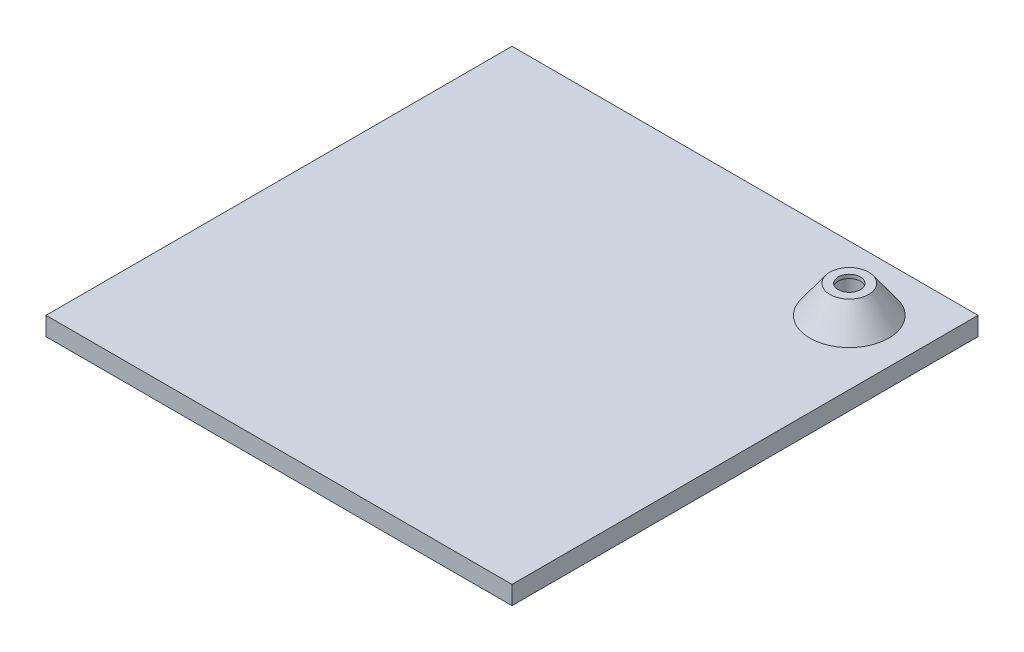
ISO-10303-21;
HEADER;
FILE_DESCRIPTION(('STEP AP214'),'2;1');
FILE_NAME('part.step','',(''),(''),'','','');
FILE_SCHEMA(('AUTOMOTIVE_DESIGN { 1 0 10303 214 1 1 1 1 }'));
ENDSEC;
DATA;
#1=APPLICATION_CONTEXT('core data for automotive mechanical design processes');
#2=APPLICATION_PROTOCOL_DEFINITION('international standard','automotive_design',2000,#1);
#3=PRODUCT_CONTEXT('',#1,'mechanical');
#4=PRODUCT('Part','Part','',(#3));
#5=PRODUCT_RELATED_PRODUCT_CATEGORY('part','',(#4));
#6=PRODUCT_DEFINITION_FORMATION('','',#4);
#7=PRODUCT_DEFINITION_CONTEXT('part definition',#1,'design');
#8=PRODUCT_DEFINITION('design','',#6,#7);
#9=PRODUCT_DEFINITION_SHAPE('','',#8);
#10=(LENGTH_UNIT() NAMED_UNIT(*) SI_UNIT(.MILLI.,.METRE.));
#11=(NAMED_UNIT(*) PLANE_ANGLE_UNIT() SI_UNIT($,.RADIAN.));
#12=(NAMED_UNIT(*) SI_UNIT($,.STERADIAN.) SOLID_ANGLE_UNIT());
#13=UNCERTAINTY_MEASURE_WITH_UNIT(LENGTH_MEASURE(1.E-05),#10,'distance_accuracy_value','');
#14=(GEOMETRIC_REPRESENTATION_CONTEXT(3) GLOBAL_UNCERTAINTY_ASSIGNED_CONTEXT((#13)) GLOBAL_UNIT_ASSIGNED_CONTEXT((#10,
#11,#12)) REPRESENTATION_CONTEXT('',''));
#15=CARTESIAN_POINT('',(0.,0.,0.));
#16=DIRECTION('',(0.,0.,1.));
#17=DIRECTION('',(1.,0.,0.));
#18=AXIS2_PLACEMENT_3D('',#15,#16,#17);
#19=CARTESIAN_POINT('',(0.,5.,0.));
#20=DIRECTION('',(1.,0.,0.));
#21=DIRECTION('',(0.,0.,-1.));
#22=AXIS2_PLACEMENT_3D('',#19,#20,#21);
#23=PLANE('',#22);
#24=DIRECTION('',(0.,0.,1.));
#25=VECTOR('',#24,1.);
#26=CARTESIAN_POINT('',(0.,0.,0.));
#27=LINE('',#26,#25);
#28=CARTESIAN_POINT('',(0.,0.,-126.));
#29=VERTEX_POINT('',#28);
#30=CARTESIAN_POINT('',(0.,0.,0.));
#31=VERTEX_POINT('',#30);
#32=EDGE_CURVE('E115',#29,#31,#27,.T.);
#33=ORIENTED_EDGE('',*,*,#32,.T.);
#34=DIRECTION('',(0.,-1.,0.));
#35=VECTOR('',#34,1.);
#36=CARTESIAN_POINT('',(0.,5.,0.));
#37=LINE('',#36,#35);
#38=CARTESIAN_POINT('',(0.,5.,0.));
#39=VERTEX_POINT('',#38);
#40=EDGE_CURVE('E104',#39,#31,#37,.T.);
#41=ORIENTED_EDGE('',*,*,#40,.F.);
#42=DIRECTION('',(0.,0.,1.));
#43=VECTOR('',#42,1.);
#44=CARTESIAN_POINT('',(0.,5.,0.));
#45=LINE('',#44,#43);
#46=CARTESIAN_POINT('',(0.,5.,-126.));
#47=VERTEX_POINT('',#46);
#48=EDGE_CURVE('E96',#47,#39,#45,.T.);
#49=ORIENTED_EDGE('',*,*,#48,.F.);
#50=DIRECTION('',(0.,-1.,0.));
#51=VECTOR('',#50,1.);
#52=CARTESIAN_POINT('',(0.,5.,-126.));
#53=LINE('',#52,#51);
#54=EDGE_CURVE('E111',#47,#29,#53,.T.);
#55=ORIENTED_EDGE('',*,*,#54,.T.);
#56=EDGE_LOOP('',(#33,#41,#49,#55));
#57=FACE_BOUND('',#56,.T.);
#58=ADVANCED_FACE('F41',(#57),#23,.F.);
#59=CARTESIAN_POINT('',(0.,5.,0.));
#60=DIRECTION('',(0.,0.,-1.));
#61=DIRECTION('',(-1.,0.,0.));
#62=AXIS2_PLACEMENT_3D('',#59,#60,#61);
#63=PLANE('',#62);
#64=DIRECTION('',(1.,0.,0.));
#65=VECTOR('',#64,1.);
#66=CARTESIAN_POINT('',(0.,0.,0.));
#67=LINE('',#66,#65);
#68=CARTESIAN_POINT('',(126.,0.,0.));
#69=VERTEX_POINT('',#68);
#70=EDGE_CURVE('E102',#31,#69,#67,.T.);
#71=ORIENTED_EDGE('',*,*,#70,.T.);
#72=DIRECTION('',(0.,-1.,0.));
#73=VECTOR('',#72,1.);
#74=CARTESIAN_POINT('',(126.,5.,0.));
#75=LINE('',#74,#73);
#76=CARTESIAN_POINT('',(126.,5.,0.));
#77=VERTEX_POINT('',#76);
#78=EDGE_CURVE('E100',#77,#69,#75,.T.);
#79=ORIENTED_EDGE('',*,*,#78,.F.);
#80=DIRECTION('',(1.,0.,0.));
#81=VECTOR('',#80,1.);
#82=CARTESIAN_POINT('',(0.,5.,0.));
#83=LINE('',#82,#81);
#84=EDGE_CURVE('E91',#39,#77,#83,.T.);
#85=ORIENTED_EDGE('',*,*,#84,.F.);
#86=ORIENTED_EDGE('',*,*,#40,.T.);
#87=EDGE_LOOP('',(#71,#79,#85,#86));
#88=FACE_BOUND('',#87,.T.);
#89=ADVANCED_FACE('F101',(#88),#63,.F.);
#90=CARTESIAN_POINT('',(126.,5.,0.));
#91=DIRECTION('',(-1.,0.,0.));
#92=DIRECTION('',(0.,0.,1.));
#93=AXIS2_PLACEMENT_3D('',#90,#91,#92);
#94=PLANE('',#93);
#95=DIRECTION('',(0.,0.,-1.));
#96=VECTOR('',#95,1.);
#97=CARTESIAN_POINT('',(126.,0.,0.));
#98=LINE('',#97,#96);
#99=CARTESIAN_POINT('',(126.,0.,-126.));
#100=VERTEX_POINT('',#99);
#101=EDGE_CURVE('E77',#69,#100,#98,.T.);
#102=ORIENTED_EDGE('',*,*,#101,.T.);
#103=DIRECTION('',(0.,-1.,0.));
#104=VECTOR('',#103,1.);
#105=CARTESIAN_POINT('',(126.,5.,-126.));
#106=LINE('',#105,#104);
#107=CARTESIAN_POINT('',(126.,5.,-126.));
#108=VERTEX_POINT('',#107);
#109=EDGE_CURVE('E105',#108,#100,#106,.T.);
#110=ORIENTED_EDGE('',*,*,#109,.F.);
#111=DIRECTION('',(0.,0.,-1.));
#112=VECTOR('',#111,1.);
#113=CARTESIAN_POINT('',(126.,5.,0.));
#114=LINE('',#113,#112);
#115=EDGE_CURVE('E94',#77,#108,#114,.T.);
#116=ORIENTED_EDGE('',*,*,#115,.F.);
#117=ORIENTED_EDGE('',*,*,#78,.T.);
#118=EDGE_LOOP('',(#102,#110,#116,#117));
#119=FACE_BOUND('',#118,.T.);
#120=ADVANCED_FACE('F107',(#119),#94,.F.);
#121=CARTESIAN_POINT('',(0.,5.,-126.));
#122=DIRECTION('',(0.,0.,1.));
#123=DIRECTION('',(1.,0.,0.));
#124=AXIS2_PLACEMENT_3D('',#121,#122,#123);
#125=PLANE('',#124);
#126=DIRECTION('',(-1.,0.,0.));
#127=VECTOR('',#126,1.);
#128=CARTESIAN_POINT('',(0.,0.,-126.));
#129=LINE('',#128,#127);
#130=EDGE_CURVE('E83',#100,#29,#129,.T.);
#131=ORIENTED_EDGE('',*,*,#130,.T.);
#132=ORIENTED_EDGE('',*,*,#54,.F.);
#133=DIRECTION('',(-1.,0.,0.));
#134=VECTOR('',#133,1.);
#135=CARTESIAN_POINT('',(0.,5.,-126.));
#136=LINE('',#135,#134);
#137=EDGE_CURVE('E60',#108,#47,#136,.T.);
#138=ORIENTED_EDGE('',*,*,#137,.F.);
#139=ORIENTED_EDGE('',*,*,#109,.T.);
#140=EDGE_LOOP('',(#131,#132,#138,#139));
#141=FACE_BOUND('',#140,.T.);
#142=ADVANCED_FACE('F163',(#141),#125,.F.);
#143=CARTESIAN_POINT('',(0.,5.,0.));
#144=DIRECTION('',(0.,-1.,0.));
#145=DIRECTION('',(0.,0.,-1.));
#146=AXIS2_PLACEMENT_3D('',#143,#144,#145);
#147=PLANE('',#146);
#148=CARTESIAN_POINT('',(108.6,5.,-108.6));
#149=DIRECTION('',(0.,-1.,0.));
#150=DIRECTION('',(0.,0.,-1.));
#151=AXIS2_PLACEMENT_3D('',#148,#149,#150);
#152=CIRCLE('',#151,10.6836436799865);
#153=CARTESIAN_POINT('',(108.6,5.,-119.283643679987));
#154=VERTEX_POINT('',#153);
#155=EDGE_CURVE('E11',#154,#154,#152,.T.);
#156=ORIENTED_EDGE('',*,*,#155,.T.);
#157=EDGE_LOOP('',(#156));
#158=FACE_BOUND('',#157,.T.);
#159=ORIENTED_EDGE('',*,*,#48,.T.);
#160=ORIENTED_EDGE('',*,*,#84,.T.);
#161=ORIENTED_EDGE('',*,*,#115,.T.);
#162=ORIENTED_EDGE('',*,*,#137,.T.);
#163=EDGE_LOOP('',(#159,#160,#161,#162));
#164=FACE_BOUND('',#163,.T.);
#165=ADVANCED_FACE('F92',(#158,#164),#147,.F.);
#166=CARTESIAN_POINT('',(0.,0.,0.));
#167=DIRECTION('',(0.,-1.,0.));
#168=DIRECTION('',(0.,0.,-1.));
#169=AXIS2_PLACEMENT_3D('',#166,#167,#168);
#170=PLANE('',#169);
#171=CARTESIAN_POINT('',(108.6,0.,-108.6));
#172=DIRECTION('',(0.,-1.,0.));
#173=DIRECTION('',(0.,0.,-1.));
#174=AXIS2_PLACEMENT_3D('',#171,#172,#173);
#175=CIRCLE('',#174,3.44999999999999);
#176=CARTESIAN_POINT('',(108.6,0.,-112.05));
#177=VERTEX_POINT('',#176);
#178=EDGE_CURVE('E135',#177,#177,#175,.T.);
#179=ORIENTED_EDGE('',*,*,#178,.F.);
#180=EDGE_LOOP('',(#179));
#181=FACE_BOUND('',#180,.T.);
#182=ORIENTED_EDGE('',*,*,#32,.F.);
#183=ORIENTED_EDGE('',*,*,#130,.F.);
#184=ORIENTED_EDGE('',*,*,#101,.F.);
#185=ORIENTED_EDGE('',*,*,#70,.F.);
#186=EDGE_LOOP('',(#182,#183,#184,#185));
#187=FACE_BOUND('',#186,.T.);
#188=ADVANCED_FACE('F166',(#181,#187),#170,.T.);
#189=CARTESIAN_POINT('',(108.6,12.5,-108.6));
#190=DIRECTION('',(0.,1.,0.));
#191=DIRECTION('',(0.,0.,1.));
#192=AXIS2_PLACEMENT_3D('',#189,#190,#191);
#193=PLANE('',#192);
#194=CARTESIAN_POINT('',(108.6,12.5,-108.6));
#195=DIRECTION('',(0.,1.,0.));
#196=DIRECTION('',(0.,0.,1.));
#197=AXIS2_PLACEMENT_3D('',#194,#195,#196);
#198=CIRCLE('',#197,5.23457471994626);
#199=CARTESIAN_POINT('',(108.6,12.5,-113.834574719946));
#200=VERTEX_POINT('',#199);
#201=EDGE_CURVE('E52',#200,#200,#198,.T.);
#202=ORIENTED_EDGE('',*,*,#201,.T.);
#203=EDGE_LOOP('',(#202));
#204=FACE_BOUND('',#203,.T.);
#205=CARTESIAN_POINT('',(108.6,12.5,-108.6));
#206=DIRECTION('',(0.,1.,0.));
#207=DIRECTION('',(0.,0.,1.));
#208=AXIS2_PLACEMENT_3D('',#205,#206,#207);
#209=CIRCLE('',#208,3.00000000000001);
#210=CARTESIAN_POINT('',(108.6,12.5,-105.6));
#211=VERTEX_POINT('',#210);
#212=EDGE_CURVE('E136',#211,#211,#209,.T.);
#213=ORIENTED_EDGE('',*,*,#212,.F.);
#214=EDGE_LOOP('',(#213));
#215=FACE_BOUND('',#214,.T.);
#216=ADVANCED_FACE('F141',(#204,#215),#193,.T.);
#217=CARTESIAN_POINT('',(108.6,11.5,-108.6));
#218=DIRECTION('',(0.,-1.,0.));
#219=DIRECTION('',(0.,0.,-1.));
#220=AXIS2_PLACEMENT_3D('',#217,#218,#219);
#221=CYLINDRICAL_SURFACE('',#220,3.44999999999999);
#222=CARTESIAN_POINT('',(108.6,11.5,-108.6));
#223=DIRECTION('',(0.,-1.,0.));
#224=DIRECTION('',(0.,0.,-1.));
#225=AXIS2_PLACEMENT_3D('',#222,#223,#224);
#226=CIRCLE('',#225,3.44999999999999);
#227=CARTESIAN_POINT('',(108.6,11.5,-112.05));
#228=VERTEX_POINT('',#227);
#229=EDGE_CURVE('E119',#228,#228,#226,.T.);
#230=ORIENTED_EDGE('',*,*,#229,.F.);
#231=EDGE_LOOP('',(#230));
#232=FACE_BOUND('',#231,.T.);
#233=ORIENTED_EDGE('',*,*,#178,.T.);
#234=EDGE_LOOP('',(#233));
#235=FACE_BOUND('',#234,.T.);
#236=ADVANCED_FACE('F175',(#232,#235),#221,.F.);
#237=CARTESIAN_POINT('',(108.6,11.5,-108.6));
#238=DIRECTION('',(0.,-1.,0.));
#239=DIRECTION('',(0.,0.,-1.));
#240=AXIS2_PLACEMENT_3D('',#237,#238,#239);
#241=PLANE('',#240);
#242=CARTESIAN_POINT('',(108.6,11.5,-108.6));
#243=DIRECTION('',(0.,-1.,0.));
#244=DIRECTION('',(0.,0.,-1.));
#245=AXIS2_PLACEMENT_3D('',#242,#243,#244);
#246=CIRCLE('',#245,3.00000000000001);
#247=CARTESIAN_POINT('',(108.6,11.5,-111.6));
#248=VERTEX_POINT('',#247);
#249=EDGE_CURVE('E132',#248,#248,#246,.T.);
#250=ORIENTED_EDGE('',*,*,#249,.F.);
#251=EDGE_LOOP('',(#250));
#252=FACE_BOUND('',#251,.T.);
#253=ORIENTED_EDGE('',*,*,#229,.T.);
#254=EDGE_LOOP('',(#253));
#255=FACE_BOUND('',#254,.T.);
#256=ADVANCED_FACE('F150',(#252,#255),#241,.T.);
#257=CARTESIAN_POINT('',(108.6,0.,-108.6));
#258=DIRECTION('',(0.,1.,0.));
#259=DIRECTION('',(0.,0.,1.));
#260=AXIS2_PLACEMENT_3D('',#257,#258,#259);
#261=CYLINDRICAL_SURFACE('',#260,3.00000000000001);
#262=ORIENTED_EDGE('',*,*,#249,.T.);
#263=EDGE_LOOP('',(#262));
#264=FACE_BOUND('',#263,.T.);
#265=ORIENTED_EDGE('',*,*,#212,.T.);
#266=EDGE_LOOP('',(#265));
#267=FACE_BOUND('',#266,.T.);
#268=ADVANCED_FACE('F145',(#264,#267),#261,.F.);
#269=CARTESIAN_POINT('',(108.6,12.5,-108.6));
#270=DIRECTION('',(0.,-1.,0.));
#271=DIRECTION('',(0.,0.,-1.));
#272=AXIS2_PLACEMENT_3D('',#269,#270,#271);
#273=CONICAL_SURFACE('',#272,5.23457471994626,0.628318530717965);
#274=CARTESIAN_POINT('',(108.6,5.,-119.283643679987));
#275=CARTESIAN_POINT('',(108.6,5.078125,-119.226882544986));
#276=CARTESIAN_POINT('',(108.6,5.15625,-119.170121409986));
#277=CARTESIAN_POINT('',(108.6,5.3125,-119.056599139985));
#278=CARTESIAN_POINT('',(108.6,5.390625,-118.999838004984));
#279=CARTESIAN_POINT('',(108.6,5.546875,-118.886315734984));
#280=CARTESIAN_POINT('',(108.6,5.625,-118.829554599983));
#281=CARTESIAN_POINT('',(108.6,5.78125,-118.716032329982));
#282=CARTESIAN_POINT('',(108.6,5.859375,-118.659271194982));
#283=CARTESIAN_POINT('',(108.6,6.015625,-118.545748924981));
#284=CARTESIAN_POINT('',(108.6,6.09375,-118.488987789981));
#285=CARTESIAN_POINT('',(108.6,6.25,-118.37546551998));
#286=CARTESIAN_POINT('',(108.6,6.328125,-118.318704384979));
#287=CARTESIAN_POINT('',(108.6,6.484375,-118.205182114979));
#288=CARTESIAN_POINT('',(108.6,6.5625,-118.148420979978));
#289=CARTESIAN_POINT('',(108.6,6.71875,-118.034898709977));
#290=CARTESIAN_POINT('',(108.6,6.796875,-117.978137574977));
#291=CARTESIAN_POINT('',(108.6,6.953125,-117.864615304976));
#292=CARTESIAN_POINT('',(108.6,7.03125,-117.807854169976));
#293=CARTESIAN_POINT('',(108.6,7.1875,-117.694331899975));
#294=CARTESIAN_POINT('',(108.6,7.265625,-117.637570764974));
#295=CARTESIAN_POINT('',(108.6,7.421875,-117.524048494974));
#296=CARTESIAN_POINT('',(108.6,7.5,-117.467287359973));
#297=CARTESIAN_POINT('',(108.6,7.65625,-117.353765089972));
#298=CARTESIAN_POINT('',(108.6,7.734375,-117.297003954972));
#299=CARTESIAN_POINT('',(108.6,7.890625,-117.183481684971));
#300=CARTESIAN_POINT('',(108.6,7.96875,-117.126720549971));
#301=CARTESIAN_POINT('',(108.6,8.125,-117.01319827997));
#302=CARTESIAN_POINT('',(108.6,8.203125,-116.956437144969));
#303=CARTESIAN_POINT('',(108.6,8.359375,-116.842914874968));
#304=CARTESIAN_POINT('',(108.6,8.4375,-116.786153739968));
#305=CARTESIAN_POINT('',(108.6,8.59375,-116.672631469967));
#306=CARTESIAN_POINT('',(108.6,8.671875,-116.615870334967));
#307=CARTESIAN_POINT('',(108.6,8.828125,-116.502348064966));
#308=CARTESIAN_POINT('',(108.6,8.90625,-116.445586929966));
#309=CARTESIAN_POINT('',(108.6,9.0625,-116.332064659965));
#310=CARTESIAN_POINT('',(108.6,9.140625,-116.275303524964));
#311=CARTESIAN_POINT('',(108.6,9.296875,-116.161781254963));
#312=CARTESIAN_POINT('',(108.6,9.375,-116.105020119963));
#313=CARTESIAN_POINT('',(108.6,9.53125,-115.991497849962));
#314=CARTESIAN_POINT('',(108.6,9.609375,-115.934736714962));
#315=CARTESIAN_POINT('',(108.6,9.765625,-115.821214444961));
#316=CARTESIAN_POINT('',(108.6,9.84375,-115.764453309961));
#317=CARTESIAN_POINT('',(108.6,10.,-115.65093103996));
#318=CARTESIAN_POINT('',(108.6,10.078125,-115.594169904959));
#319=CARTESIAN_POINT('',(108.6,10.234375,-115.480647634958));
#320=CARTESIAN_POINT('',(108.6,10.3125,-115.423886499958));
#321=CARTESIAN_POINT('',(108.6,10.46875,-115.310364229957));
#322=CARTESIAN_POINT('',(108.6,10.546875,-115.253603094957));
#323=CARTESIAN_POINT('',(108.6,10.703125,-115.140080824956));
#324=CARTESIAN_POINT('',(108.6,10.78125,-115.083319689955));
#325=CARTESIAN_POINT('',(108.6,10.9375,-114.969797419955));
#326=CARTESIAN_POINT('',(108.6,11.015625,-114.913036284954));
#327=CARTESIAN_POINT('',(108.6,11.171875,-114.799514014953));
#328=CARTESIAN_POINT('',(108.6,11.25,-114.742752879953));
#329=CARTESIAN_POINT('',(108.6,11.40625,-114.629230609952));
#330=CARTESIAN_POINT('',(108.6,11.484375,-114.572469474952));
#331=CARTESIAN_POINT('',(108.6,11.640625,-114.458947204951));
#332=CARTESIAN_POINT('',(108.6,11.71875,-114.40218606995));
#333=CARTESIAN_POINT('',(108.6,11.875,-114.28866379995));
#334=CARTESIAN_POINT('',(108.6,11.953125,-114.231902664949));
#335=CARTESIAN_POINT('',(108.6,12.109375,-114.118380394948));
#336=CARTESIAN_POINT('',(108.6,12.1875,-114.061619259948));
#337=CARTESIAN_POINT('',(108.6,12.34375,-113.948096989947));
#338=CARTESIAN_POINT('',(108.6,12.421875,-113.891335854947));
#339=CARTESIAN_POINT('',(108.6,12.5,-113.834574719946));
#340=B_SPLINE_CURVE_WITH_KNOTS('',3,(#274,#275,#276,#277,#278,#279,#280,#281,#282,#283,#284,
#285,#286,#287,#288,#289,#290,#291,#292,#293,#294,#295,#296,#297,#298,#299,#300,#301,#302,#303,
#304,#305,#306,#307,#308,#309,#310,#311,#312,#313,#314,#315,#316,#317,#318,#319,#320,#321,#322,
#323,#324,#325,#326,#327,#328,#329,#330,#331,#332,#333,#334,#335,#336,#337,#338,#339),
.UNSPECIFIED.,.F.,.F.,(4,2,2,2,2,2,2,2,2,2,2,2,2,2,2,2,2,2,2,2,2,2,2,2,2,2,2,2,2,2,2,2,4),(0.,
0.289703432226508,0.579406864453025,0.869110296679541,1.15881372890605,1.44851716113257,
1.73822059335908,2.0279240255856,2.31762745781211,2.60733089003862,2.89703432226514,
3.18673775449166,3.47644118671817,3.76614461894468,4.0558480511712,4.34555148339771,
4.63525491562423,4.92495834785074,5.21466178007725,5.50436521230377,5.79406864453029,
6.0837720767568,6.37347550898331,6.66317894120983,6.95288237343634,7.24258580566286,
7.53228923788937,7.82199267011588,8.1116961023424,8.40139953456892,8.69110296679543,
8.98080639902195,9.27050983124846),.UNSPECIFIED.);
#341=EDGE_CURVE('BSEAM44',#154,#200,#340,.T.);
#342=ORIENTED_EDGE('',*,*,#155,.F.);
#343=ORIENTED_EDGE('',*,*,#201,.F.);
#344=ORIENTED_EDGE('',*,*,#341,.T.);
#345=ORIENTED_EDGE('',*,*,#341,.F.);
#346=EDGE_LOOP('',(#342,#344,#343,#345));
#347=FACE_BOUND('',#346,.T.);
#348=ADVANCED_FACE('F44',(#347),#273,.T.);
#349=CLOSED_SHELL('',(#58,#89,#120,#142,#165,#188,#216,#236,#256,#268,#348));
#350=MANIFOLD_SOLID_BREP('B2',#349);
#351=ADVANCED_BREP_SHAPE_REPRESENTATION('',(#18,#350),#14);
#352=SHAPE_DEFINITION_REPRESENTATION(#9,#351);
ENDSEC;
END-ISO-10303-21;
